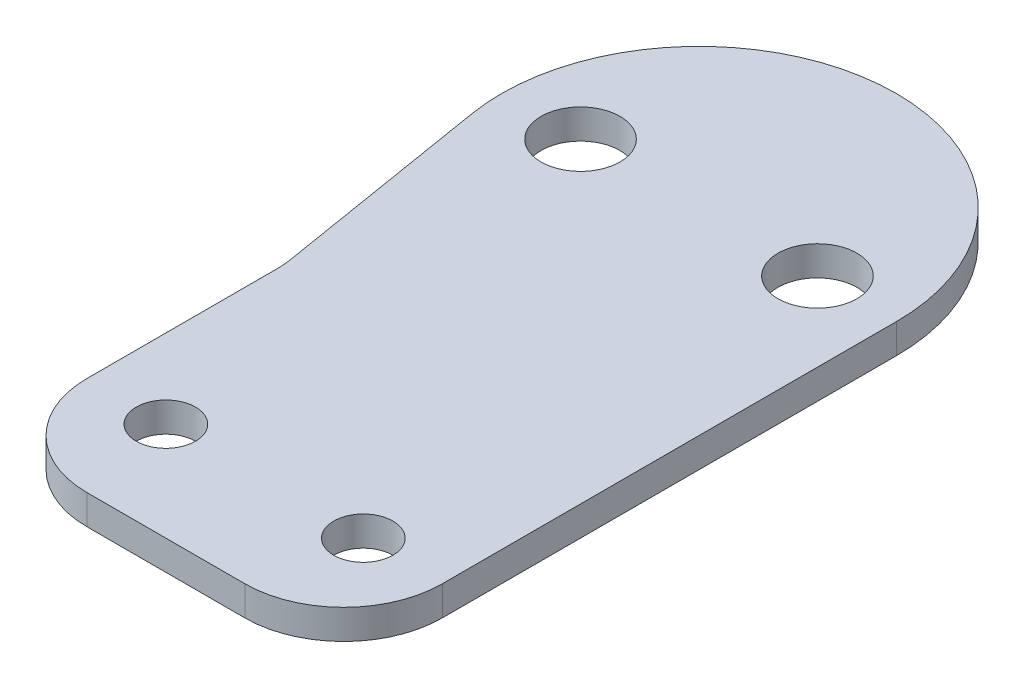
ISO-10303-21;
HEADER;
FILE_DESCRIPTION(('STEP AP214'),'2;1');
FILE_NAME('part.step','',(''),(''),'','','');
FILE_SCHEMA(('AUTOMOTIVE_DESIGN { 1 0 10303 214 1 1 1 1 }'));
ENDSEC;
DATA;
#1=APPLICATION_CONTEXT('core data for automotive mechanical design processes');
#2=APPLICATION_PROTOCOL_DEFINITION('international standard','automotive_design',2000,#1);
#3=PRODUCT_CONTEXT('',#1,'mechanical');
#4=PRODUCT('Part','Part','',(#3));
#5=PRODUCT_RELATED_PRODUCT_CATEGORY('part','',(#4));
#6=PRODUCT_DEFINITION_FORMATION('','',#4);
#7=PRODUCT_DEFINITION_CONTEXT('part definition',#1,'design');
#8=PRODUCT_DEFINITION('design','',#6,#7);
#9=PRODUCT_DEFINITION_SHAPE('','',#8);
#10=(LENGTH_UNIT() NAMED_UNIT(*) SI_UNIT(.MILLI.,.METRE.));
#11=(NAMED_UNIT(*) PLANE_ANGLE_UNIT() SI_UNIT($,.RADIAN.));
#12=(NAMED_UNIT(*) SI_UNIT($,.STERADIAN.) SOLID_ANGLE_UNIT());
#13=UNCERTAINTY_MEASURE_WITH_UNIT(LENGTH_MEASURE(1.E-05),#10,'distance_accuracy_value','');
#14=(GEOMETRIC_REPRESENTATION_CONTEXT(3) GLOBAL_UNCERTAINTY_ASSIGNED_CONTEXT((#13)) GLOBAL_UNIT_ASSIGNED_CONTEXT((#10,
#11,#12)) REPRESENTATION_CONTEXT('',''));
#15=CARTESIAN_POINT('',(0.,0.,0.));
#16=DIRECTION('',(0.,0.,1.));
#17=DIRECTION('',(1.,0.,0.));
#18=AXIS2_PLACEMENT_3D('',#15,#16,#17);
#19=CARTESIAN_POINT('',(-1.00000000000001,1.5,-9.));
#20=DIRECTION('',(0.,-1.,0.));
#21=DIRECTION('',(0.,0.,-1.));
#22=AXIS2_PLACEMENT_3D('',#19,#20,#21);
#23=CYLINDRICAL_SURFACE('',#22,10.);
#24=CARTESIAN_POINT('',(-1.00000000000001,0.,-9.));
#25=DIRECTION('',(0.,1.,0.));
#26=DIRECTION('',(0.,0.,1.));
#27=AXIS2_PLACEMENT_3D('',#24,#25,#26);
#28=CIRCLE('',#27,10.);
#29=CARTESIAN_POINT('',(8.99999999999999,0.,-9.00000000000001));
#30=VERTEX_POINT('',#29);
#31=CARTESIAN_POINT('',(-10.8679533790009,0.,-7.38027900246206));
#32=VERTEX_POINT('',#31);
#33=EDGE_CURVE('E134',#30,#32,#28,.T.);
#34=ORIENTED_EDGE('',*,*,#33,.T.);
#35=DIRECTION('',(0.,-1.,0.));
#36=VECTOR('',#35,1.);
#37=CARTESIAN_POINT('',(-10.8679533790009,1.5,-7.38027900246206));
#38=LINE('',#37,#36);
#39=CARTESIAN_POINT('',(-10.8679533790009,1.5,-7.38027900246206));
#40=VERTEX_POINT('',#39);
#41=EDGE_CURVE('E113',#40,#32,#38,.T.);
#42=ORIENTED_EDGE('',*,*,#41,.F.);
#43=CARTESIAN_POINT('',(-1.00000000000001,1.5,-9.));
#44=DIRECTION('',(0.,1.,0.));
#45=DIRECTION('',(0.,0.,1.));
#46=AXIS2_PLACEMENT_3D('',#43,#44,#45);
#47=CIRCLE('',#46,10.);
#48=CARTESIAN_POINT('',(8.99999999999999,1.5,-9.00000000000001));
#49=VERTEX_POINT('',#48);
#50=EDGE_CURVE('E120',#49,#40,#47,.T.);
#51=ORIENTED_EDGE('',*,*,#50,.F.);
#52=DIRECTION('',(0.,-1.,0.));
#53=VECTOR('',#52,1.);
#54=CARTESIAN_POINT('',(8.99999999999999,1.5,-9.00000000000001));
#55=LINE('',#54,#53);
#56=EDGE_CURVE('E137',#49,#30,#55,.T.);
#57=ORIENTED_EDGE('',*,*,#56,.T.);
#58=EDGE_LOOP('',(#34,#42,#51,#57));
#59=FACE_BOUND('',#58,.T.);
#60=ADVANCED_FACE('F41',(#59),#23,.T.);
#61=CARTESIAN_POINT('',(-9.40321860173985,1.5,1.54343966055699));
#62=DIRECTION('',(0.986795337900087,0.,-0.161972099753794));
#63=DIRECTION('',(-0.161972099753794,0.,-0.986795337900087));
#64=AXIS2_PLACEMENT_3D('',#61,#62,#63);
#65=PLANE('',#64);
#66=DIRECTION('',(0.161972099753794,0.,0.986795337900087));
#67=VECTOR('',#66,1.);
#68=CARTESIAN_POINT('',(-9.40321860173985,0.,1.54343966055699));
#69=LINE('',#68,#67);
#70=CARTESIAN_POINT('',(-9.06602331049956,0.,3.59776100271136));
#71=VERTEX_POINT('',#70);
#72=EDGE_CURVE('E177',#32,#71,#69,.T.);
#73=ORIENTED_EDGE('',*,*,#72,.T.);
#74=DIRECTION('',(0.,-1.,0.));
#75=VECTOR('',#74,1.);
#76=CARTESIAN_POINT('',(-9.06602331049956,1.5,3.59776100271136));
#77=LINE('',#76,#75);
#78=CARTESIAN_POINT('',(-9.06602331049956,1.5,3.59776100271136));
#79=VERTEX_POINT('',#78);
#80=EDGE_CURVE('E116',#71,#79,#77,.F.);
#81=ORIENTED_EDGE('',*,*,#80,.T.);
#82=DIRECTION('',(0.161972099753794,0.,0.986795337900087));
#83=VECTOR('',#82,1.);
#84=CARTESIAN_POINT('',(-9.40321860173985,1.5,1.54343966055699));
#85=LINE('',#84,#83);
#86=EDGE_CURVE('E108',#40,#79,#85,.T.);
#87=ORIENTED_EDGE('',*,*,#86,.F.);
#88=ORIENTED_EDGE('',*,*,#41,.T.);
#89=EDGE_LOOP('',(#73,#81,#87,#88));
#90=FACE_BOUND('',#89,.T.);
#91=ADVANCED_FACE('F111',(#90),#65,.F.);
#92=CARTESIAN_POINT('',(-9.,1.5,0.));
#93=DIRECTION('',(-1.,0.,0.));
#94=DIRECTION('',(0.,0.,1.));
#95=AXIS2_PLACEMENT_3D('',#92,#93,#94);
#96=PLANE('',#95);
#97=DIRECTION('',(0.,0.,-1.));
#98=VECTOR('',#97,1.);
#99=CARTESIAN_POINT('',(-9.,1.5,0.));
#100=LINE('',#99,#98);
#101=CARTESIAN_POINT('',(-9.,1.5,14.));
#102=VERTEX_POINT('',#101);
#103=CARTESIAN_POINT('',(-9.,1.5,4.40762150148033));
#104=VERTEX_POINT('',#103);
#105=EDGE_CURVE('E119',#102,#104,#100,.T.);
#106=ORIENTED_EDGE('',*,*,#105,.T.);
#107=DIRECTION('',(0.,-1.,0.));
#108=VECTOR('',#107,1.);
#109=CARTESIAN_POINT('',(-9.,1.5,4.40762150148033));
#110=LINE('',#109,#108);
#111=CARTESIAN_POINT('',(-9.,0.,4.40762150148033));
#112=VERTEX_POINT('',#111);
#113=EDGE_CURVE('E141',#104,#112,#110,.T.);
#114=ORIENTED_EDGE('',*,*,#113,.T.);
#115=DIRECTION('',(0.,0.,-1.));
#116=VECTOR('',#115,1.);
#117=CARTESIAN_POINT('',(-9.,0.,0.));
#118=LINE('',#117,#116);
#119=CARTESIAN_POINT('',(-9.,0.,14.));
#120=VERTEX_POINT('',#119);
#121=EDGE_CURVE('E179',#120,#112,#118,.T.);
#122=ORIENTED_EDGE('',*,*,#121,.F.);
#123=DIRECTION('',(0.,-1.,0.));
#124=VECTOR('',#123,1.);
#125=CARTESIAN_POINT('',(-9.,1.5,14.));
#126=LINE('',#125,#124);
#127=EDGE_CURVE('E136',#120,#102,#126,.F.);
#128=ORIENTED_EDGE('',*,*,#127,.T.);
#129=EDGE_LOOP('',(#106,#114,#122,#128));
#130=FACE_BOUND('',#129,.T.);
#131=ADVANCED_FACE('F188',(#130),#96,.T.);
#132=CARTESIAN_POINT('',(0.,1.5,19.));
#133=DIRECTION('',(0.,0.,-1.));
#134=DIRECTION('',(-1.,0.,0.));
#135=AXIS2_PLACEMENT_3D('',#132,#133,#134);
#136=PLANE('',#135);
#137=DIRECTION('',(1.,0.,0.));
#138=VECTOR('',#137,1.);
#139=CARTESIAN_POINT('',(0.,1.5,19.));
#140=LINE('',#139,#138);
#141=CARTESIAN_POINT('',(-4.,1.5,19.));
#142=VERTEX_POINT('',#141);
#143=CARTESIAN_POINT('',(4.,1.5,19.));
#144=VERTEX_POINT('',#143);
#145=EDGE_CURVE('E191',#142,#144,#140,.T.);
#146=ORIENTED_EDGE('',*,*,#145,.F.);
#147=DIRECTION('',(0.,-1.,0.));
#148=VECTOR('',#147,1.);
#149=CARTESIAN_POINT('',(-4.,0.,19.));
#150=LINE('',#149,#148);
#151=CARTESIAN_POINT('',(-4.,0.,19.));
#152=VERTEX_POINT('',#151);
#153=EDGE_CURVE('E155',#142,#152,#150,.T.);
#154=ORIENTED_EDGE('',*,*,#153,.T.);
#155=DIRECTION('',(1.,0.,0.));
#156=VECTOR('',#155,1.);
#157=CARTESIAN_POINT('',(0.,0.,19.));
#158=LINE('',#157,#156);
#159=CARTESIAN_POINT('',(4.,0.,19.));
#160=VERTEX_POINT('',#159);
#161=EDGE_CURVE('E217',#152,#160,#158,.T.);
#162=ORIENTED_EDGE('',*,*,#161,.T.);
#163=DIRECTION('',(0.,-1.,0.));
#164=VECTOR('',#163,1.);
#165=CARTESIAN_POINT('',(4.,1.5,19.));
#166=LINE('',#165,#164);
#167=EDGE_CURVE('E152',#160,#144,#166,.F.);
#168=ORIENTED_EDGE('',*,*,#167,.T.);
#169=EDGE_LOOP('',(#146,#154,#162,#168));
#170=FACE_BOUND('',#169,.T.);
#171=ADVANCED_FACE('F266',(#170),#136,.F.);
#172=CARTESIAN_POINT('',(-5.,1.5,14.));
#173=DIRECTION('',(0.,-1.,0.));
#174=DIRECTION('',(0.,0.,-1.));
#175=AXIS2_PLACEMENT_3D('',#172,#173,#174);
#176=CYLINDRICAL_SURFACE('',#175,1.5);
#177=CARTESIAN_POINT('',(-5.,1.5,14.));
#178=DIRECTION('',(0.,1.,0.));
#179=DIRECTION('',(0.,0.,1.));
#180=AXIS2_PLACEMENT_3D('',#177,#178,#179);
#181=CIRCLE('',#180,1.5);
#182=CARTESIAN_POINT('',(-5.,1.5,15.5));
#183=VERTEX_POINT('',#182);
#184=EDGE_CURVE('E206',#183,#183,#181,.T.);
#185=ORIENTED_EDGE('',*,*,#184,.T.);
#186=EDGE_LOOP('',(#185));
#187=FACE_BOUND('',#186,.T.);
#188=CARTESIAN_POINT('',(-5.,0.,14.));
#189=DIRECTION('',(0.,1.,0.));
#190=DIRECTION('',(0.,0.,1.));
#191=AXIS2_PLACEMENT_3D('',#188,#189,#190);
#192=CIRCLE('',#191,1.5);
#193=CARTESIAN_POINT('',(-5.,0.,15.5));
#194=VERTEX_POINT('',#193);
#195=EDGE_CURVE('E232',#194,#194,#192,.T.);
#196=ORIENTED_EDGE('',*,*,#195,.F.);
#197=EDGE_LOOP('',(#196));
#198=FACE_BOUND('',#197,.T.);
#199=ADVANCED_FACE('F284',(#187,#198),#176,.F.);
#200=CARTESIAN_POINT('',(-7.00000000000001,1.5,-9.));
#201=DIRECTION('',(0.,-1.,0.));
#202=DIRECTION('',(0.,0.,-1.));
#203=AXIS2_PLACEMENT_3D('',#200,#201,#202);
#204=CYLINDRICAL_SURFACE('',#203,2.);
#205=CARTESIAN_POINT('',(-7.00000000000001,1.5,-9.));
#206=DIRECTION('',(0.,1.,0.));
#207=DIRECTION('',(0.,0.,1.));
#208=AXIS2_PLACEMENT_3D('',#205,#206,#207);
#209=CIRCLE('',#208,2.);
#210=CARTESIAN_POINT('',(-7.00000000000001,1.5,-7.));
#211=VERTEX_POINT('',#210);
#212=EDGE_CURVE('E202',#211,#211,#209,.T.);
#213=ORIENTED_EDGE('',*,*,#212,.T.);
#214=EDGE_LOOP('',(#213));
#215=FACE_BOUND('',#214,.T.);
#216=CARTESIAN_POINT('',(-7.00000000000001,0.,-9.));
#217=DIRECTION('',(0.,1.,0.));
#218=DIRECTION('',(0.,0.,1.));
#219=AXIS2_PLACEMENT_3D('',#216,#217,#218);
#220=CIRCLE('',#219,2.);
#221=CARTESIAN_POINT('',(-7.00000000000001,0.,-7.));
#222=VERTEX_POINT('',#221);
#223=EDGE_CURVE('E228',#222,#222,#220,.T.);
#224=ORIENTED_EDGE('',*,*,#223,.F.);
#225=EDGE_LOOP('',(#224));
#226=FACE_BOUND('',#225,.T.);
#227=ADVANCED_FACE('F278',(#215,#226),#204,.F.);
#228=CARTESIAN_POINT('',(4.99999999999999,1.5,-9.));
#229=DIRECTION('',(0.,-1.,0.));
#230=DIRECTION('',(0.,0.,-1.));
#231=AXIS2_PLACEMENT_3D('',#228,#229,#230);
#232=CYLINDRICAL_SURFACE('',#231,1.99999999999999);
#233=CARTESIAN_POINT('',(4.99999999999999,1.5,-9.));
#234=DIRECTION('',(0.,1.,0.));
#235=DIRECTION('',(0.,0.,1.));
#236=AXIS2_PLACEMENT_3D('',#233,#234,#235);
#237=CIRCLE('',#236,1.99999999999999);
#238=CARTESIAN_POINT('',(4.99999999999999,1.5,-7.));
#239=VERTEX_POINT('',#238);
#240=EDGE_CURVE('E198',#239,#239,#237,.T.);
#241=ORIENTED_EDGE('',*,*,#240,.T.);
#242=EDGE_LOOP('',(#241));
#243=FACE_BOUND('',#242,.T.);
#244=CARTESIAN_POINT('',(4.99999999999999,0.,-9.));
#245=DIRECTION('',(0.,1.,0.));
#246=DIRECTION('',(0.,0.,1.));
#247=AXIS2_PLACEMENT_3D('',#244,#245,#246);
#248=CIRCLE('',#247,1.99999999999999);
#249=CARTESIAN_POINT('',(4.99999999999999,0.,-7.));
#250=VERTEX_POINT('',#249);
#251=EDGE_CURVE('E224',#250,#250,#248,.T.);
#252=ORIENTED_EDGE('',*,*,#251,.F.);
#253=EDGE_LOOP('',(#252));
#254=FACE_BOUND('',#253,.T.);
#255=ADVANCED_FACE('F271',(#243,#254),#232,.F.);
#256=CARTESIAN_POINT('',(9.,1.5,0.));
#257=DIRECTION('',(-1.,0.,0.));
#258=DIRECTION('',(0.,0.,1.));
#259=AXIS2_PLACEMENT_3D('',#256,#257,#258);
#260=PLANE('',#259);
#261=DIRECTION('',(0.,0.,-1.));
#262=VECTOR('',#261,1.);
#263=CARTESIAN_POINT('',(9.,1.5,0.));
#264=LINE('',#263,#262);
#265=CARTESIAN_POINT('',(9.,1.5,14.));
#266=VERTEX_POINT('',#265);
#267=EDGE_CURVE('E126',#266,#49,#264,.T.);
#268=ORIENTED_EDGE('',*,*,#267,.F.);
#269=DIRECTION('',(0.,-1.,0.));
#270=VECTOR('',#269,1.);
#271=CARTESIAN_POINT('',(9.,1.5,14.));
#272=LINE('',#271,#270);
#273=CARTESIAN_POINT('',(9.,0.,14.));
#274=VERTEX_POINT('',#273);
#275=EDGE_CURVE('E169',#266,#274,#272,.T.);
#276=ORIENTED_EDGE('',*,*,#275,.T.);
#277=DIRECTION('',(0.,0.,-1.));
#278=VECTOR('',#277,1.);
#279=CARTESIAN_POINT('',(9.,0.,0.));
#280=LINE('',#279,#278);
#281=EDGE_CURVE('E221',#274,#30,#280,.T.);
#282=ORIENTED_EDGE('',*,*,#281,.T.);
#283=ORIENTED_EDGE('',*,*,#56,.F.);
#284=EDGE_LOOP('',(#268,#276,#282,#283));
#285=FACE_BOUND('',#284,.T.);
#286=ADVANCED_FACE('F269',(#285),#260,.F.);
#287=CARTESIAN_POINT('',(5.,1.5,14.));
#288=DIRECTION('',(0.,-1.,0.));
#289=DIRECTION('',(0.,0.,-1.));
#290=AXIS2_PLACEMENT_3D('',#287,#288,#289);
#291=CYLINDRICAL_SURFACE('',#290,1.5);
#292=CARTESIAN_POINT('',(5.,1.5,14.));
#293=DIRECTION('',(0.,1.,0.));
#294=DIRECTION('',(0.,0.,1.));
#295=AXIS2_PLACEMENT_3D('',#292,#293,#294);
#296=CIRCLE('',#295,1.5);
#297=CARTESIAN_POINT('',(5.,1.5,15.5));
#298=VERTEX_POINT('',#297);
#299=EDGE_CURVE('E143',#298,#298,#296,.F.);
#300=ORIENTED_EDGE('',*,*,#299,.F.);
#301=EDGE_LOOP('',(#300));
#302=FACE_BOUND('',#301,.T.);
#303=CARTESIAN_POINT('',(5.,0.,14.));
#304=DIRECTION('',(0.,1.,0.));
#305=DIRECTION('',(0.,0.,1.));
#306=AXIS2_PLACEMENT_3D('',#303,#304,#305);
#307=CIRCLE('',#306,1.5);
#308=CARTESIAN_POINT('',(5.,0.,15.5));
#309=VERTEX_POINT('',#308);
#310=EDGE_CURVE('E131',#309,#309,#307,.F.);
#311=ORIENTED_EDGE('',*,*,#310,.T.);
#312=EDGE_LOOP('',(#311));
#313=FACE_BOUND('',#312,.T.);
#314=ADVANCED_FACE('F239',(#302,#313),#291,.F.);
#315=CARTESIAN_POINT('',(0.,1.5,0.));
#316=DIRECTION('',(0.,1.,0.));
#317=DIRECTION('',(0.,0.,1.));
#318=AXIS2_PLACEMENT_3D('',#315,#316,#317);
#319=PLANE('',#318);
#320=ORIENTED_EDGE('',*,*,#105,.F.);
#321=CARTESIAN_POINT('',(-4.,1.5,14.));
#322=DIRECTION('',(0.,1.,0.));
#323=DIRECTION('',(0.,0.,1.));
#324=AXIS2_PLACEMENT_3D('',#321,#322,#323);
#325=CIRCLE('',#324,5.);
#326=EDGE_CURVE('E166',#102,#142,#325,.T.);
#327=ORIENTED_EDGE('',*,*,#326,.T.);
#328=ORIENTED_EDGE('',*,*,#145,.T.);
#329=CARTESIAN_POINT('',(4.,1.5,14.));
#330=DIRECTION('',(0.,1.,0.));
#331=DIRECTION('',(0.,0.,1.));
#332=AXIS2_PLACEMENT_3D('',#329,#330,#331);
#333=CIRCLE('',#332,5.);
#334=EDGE_CURVE('E57',#144,#266,#333,.T.);
#335=ORIENTED_EDGE('',*,*,#334,.T.);
#336=ORIENTED_EDGE('',*,*,#267,.T.);
#337=ORIENTED_EDGE('',*,*,#50,.T.);
#338=ORIENTED_EDGE('',*,*,#86,.T.);
#339=CARTESIAN_POINT('',(-14.,1.5,4.40762150148033));
#340=DIRECTION('',(0.,1.,0.));
#341=DIRECTION('',(0.,0.,1.));
#342=AXIS2_PLACEMENT_3D('',#339,#340,#341);
#343=CIRCLE('',#342,5.);
#344=EDGE_CURVE('E11',#79,#104,#343,.F.);
#345=ORIENTED_EDGE('',*,*,#344,.T.);
#346=EDGE_LOOP('',(#320,#327,#328,#335,#336,#337,#338,#345));
#347=FACE_BOUND('',#346,.T.);
#348=ORIENTED_EDGE('',*,*,#240,.F.);
#349=EDGE_LOOP('',(#348));
#350=FACE_BOUND('',#349,.T.);
#351=ORIENTED_EDGE('',*,*,#212,.F.);
#352=EDGE_LOOP('',(#351));
#353=FACE_BOUND('',#352,.T.);
#354=ORIENTED_EDGE('',*,*,#184,.F.);
#355=EDGE_LOOP('',(#354));
#356=FACE_BOUND('',#355,.T.);
#357=ORIENTED_EDGE('',*,*,#299,.T.);
#358=EDGE_LOOP('',(#357));
#359=FACE_BOUND('',#358,.T.);
#360=ADVANCED_FACE('F124',(#347,#350,#353,#356,#359),#319,.T.);
#361=CARTESIAN_POINT('',(0.,0.,0.));
#362=DIRECTION('',(0.,1.,0.));
#363=DIRECTION('',(0.,0.,1.));
#364=AXIS2_PLACEMENT_3D('',#361,#362,#363);
#365=PLANE('',#364);
#366=ORIENTED_EDGE('',*,*,#161,.F.);
#367=CARTESIAN_POINT('',(-4.,0.,14.));
#368=DIRECTION('',(0.,1.,0.));
#369=DIRECTION('',(0.,0.,1.));
#370=AXIS2_PLACEMENT_3D('',#367,#368,#369);
#371=CIRCLE('',#370,5.);
#372=EDGE_CURVE('E161',#152,#120,#371,.F.);
#373=ORIENTED_EDGE('',*,*,#372,.T.);
#374=ORIENTED_EDGE('',*,*,#121,.T.);
#375=CARTESIAN_POINT('',(-14.,0.,4.40762150148033));
#376=DIRECTION('',(0.,1.,0.));
#377=DIRECTION('',(0.,0.,1.));
#378=AXIS2_PLACEMENT_3D('',#375,#376,#377);
#379=CIRCLE('',#378,5.);
#380=EDGE_CURVE('E50',#112,#71,#379,.T.);
#381=ORIENTED_EDGE('',*,*,#380,.T.);
#382=ORIENTED_EDGE('',*,*,#72,.F.);
#383=ORIENTED_EDGE('',*,*,#33,.F.);
#384=ORIENTED_EDGE('',*,*,#281,.F.);
#385=CARTESIAN_POINT('',(4.,0.,14.));
#386=DIRECTION('',(0.,1.,0.));
#387=DIRECTION('',(0.,0.,1.));
#388=AXIS2_PLACEMENT_3D('',#385,#386,#387);
#389=CIRCLE('',#388,5.);
#390=EDGE_CURVE('E65',#274,#160,#389,.F.);
#391=ORIENTED_EDGE('',*,*,#390,.T.);
#392=EDGE_LOOP('',(#366,#373,#374,#381,#382,#383,#384,#391));
#393=FACE_BOUND('',#392,.T.);
#394=ORIENTED_EDGE('',*,*,#251,.T.);
#395=EDGE_LOOP('',(#394));
#396=FACE_BOUND('',#395,.T.);
#397=ORIENTED_EDGE('',*,*,#223,.T.);
#398=EDGE_LOOP('',(#397));
#399=FACE_BOUND('',#398,.T.);
#400=ORIENTED_EDGE('',*,*,#195,.T.);
#401=EDGE_LOOP('',(#400));
#402=FACE_BOUND('',#401,.T.);
#403=ORIENTED_EDGE('',*,*,#310,.F.);
#404=EDGE_LOOP('',(#403));
#405=FACE_BOUND('',#404,.T.);
#406=ADVANCED_FACE('F175',(#393,#396,#399,#402,#405),#365,.F.);
#407=CARTESIAN_POINT('',(-14.,1.5,4.40762150148033));
#408=DIRECTION('',(0.,-1.,0.));
#409=DIRECTION('',(0.,0.,-1.));
#410=AXIS2_PLACEMENT_3D('',#407,#408,#409);
#411=CYLINDRICAL_SURFACE('',#410,5.);
#412=ORIENTED_EDGE('',*,*,#344,.F.);
#413=ORIENTED_EDGE('',*,*,#80,.F.);
#414=ORIENTED_EDGE('',*,*,#380,.F.);
#415=ORIENTED_EDGE('',*,*,#113,.F.);
#416=EDGE_LOOP('',(#412,#413,#414,#415));
#417=FACE_BOUND('',#416,.T.);
#418=ADVANCED_FACE('F184',(#417),#411,.F.);
#419=CARTESIAN_POINT('',(-4.,1.5,14.));
#420=DIRECTION('',(0.,1.,0.));
#421=DIRECTION('',(0.,0.,1.));
#422=AXIS2_PLACEMENT_3D('',#419,#420,#421);
#423=CYLINDRICAL_SURFACE('',#422,5.);
#424=ORIENTED_EDGE('',*,*,#326,.F.);
#425=ORIENTED_EDGE('',*,*,#127,.F.);
#426=ORIENTED_EDGE('',*,*,#372,.F.);
#427=ORIENTED_EDGE('',*,*,#153,.F.);
#428=EDGE_LOOP('',(#424,#425,#426,#427));
#429=FACE_BOUND('',#428,.T.);
#430=ADVANCED_FACE('F247',(#429),#423,.T.);
#431=CARTESIAN_POINT('',(4.,1.5,14.));
#432=DIRECTION('',(0.,-1.,0.));
#433=DIRECTION('',(0.,0.,-1.));
#434=AXIS2_PLACEMENT_3D('',#431,#432,#433);
#435=CYLINDRICAL_SURFACE('',#434,5.);
#436=ORIENTED_EDGE('',*,*,#334,.F.);
#437=ORIENTED_EDGE('',*,*,#167,.F.);
#438=ORIENTED_EDGE('',*,*,#390,.F.);
#439=ORIENTED_EDGE('',*,*,#275,.F.);
#440=EDGE_LOOP('',(#436,#437,#438,#439));
#441=FACE_BOUND('',#440,.T.);
#442=ADVANCED_FACE('F43',(#441),#435,.T.);
#443=CLOSED_SHELL('',(#60,#91,#131,#171,#199,#227,#255,#286,#314,#360,#406,#418,#430,#442));
#444=MANIFOLD_SOLID_BREP('B2',#443);
#445=ADVANCED_BREP_SHAPE_REPRESENTATION('',(#18,#444),#14);
#446=SHAPE_DEFINITION_REPRESENTATION(#9,#445);
ENDSEC;
END-ISO-10303-21;
